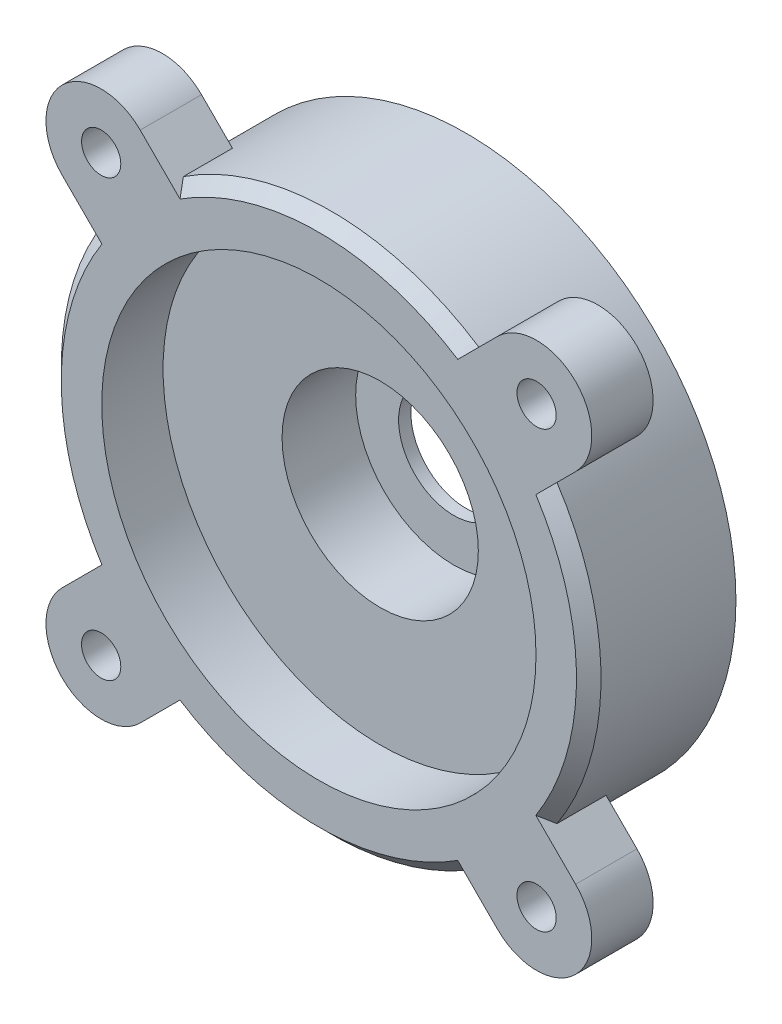
ISO-10303-21;
HEADER;
FILE_DESCRIPTION(('STEP AP214'),'2;1');
FILE_NAME('part.step','',(''),(''),'','','');
FILE_SCHEMA(('AUTOMOTIVE_DESIGN { 1 0 10303 214 1 1 1 1 }'));
ENDSEC;
DATA;
#1=APPLICATION_CONTEXT('core data for automotive mechanical design processes');
#2=APPLICATION_PROTOCOL_DEFINITION('international standard','automotive_design',2000,#1);
#3=PRODUCT_CONTEXT('',#1,'mechanical');
#4=PRODUCT('Part','Part','',(#3));
#5=PRODUCT_RELATED_PRODUCT_CATEGORY('part','',(#4));
#6=PRODUCT_DEFINITION_FORMATION('','',#4);
#7=PRODUCT_DEFINITION_CONTEXT('part definition',#1,'design');
#8=PRODUCT_DEFINITION('design','',#6,#7);
#9=PRODUCT_DEFINITION_SHAPE('','',#8);
#10=(LENGTH_UNIT() NAMED_UNIT(*) SI_UNIT(.MILLI.,.METRE.));
#11=(NAMED_UNIT(*) PLANE_ANGLE_UNIT() SI_UNIT($,.RADIAN.));
#12=(NAMED_UNIT(*) SI_UNIT($,.STERADIAN.) SOLID_ANGLE_UNIT());
#13=UNCERTAINTY_MEASURE_WITH_UNIT(LENGTH_MEASURE(1.E-05),#10,'distance_accuracy_value','');
#14=(GEOMETRIC_REPRESENTATION_CONTEXT(3) GLOBAL_UNCERTAINTY_ASSIGNED_CONTEXT((#13)) GLOBAL_UNIT_ASSIGNED_CONTEXT((#10,
#11,#12)) REPRESENTATION_CONTEXT('',''));
#15=CARTESIAN_POINT('',(0.,0.,0.));
#16=DIRECTION('',(0.,0.,1.));
#17=DIRECTION('',(1.,0.,0.));
#18=AXIS2_PLACEMENT_3D('',#15,#16,#17);
#19=CARTESIAN_POINT('',(0.,0.,6.));
#20=DIRECTION('',(0.,0.,-1.));
#21=DIRECTION('',(-1.,0.,0.));
#22=AXIS2_PLACEMENT_3D('',#19,#20,#21);
#23=CONICAL_SURFACE('',#22,21.,0.785398163397448);
#24=CARTESIAN_POINT('',(-11.3221844044348,17.6861454351131,6.0002));
#25=CARTESIAN_POINT('',(-11.442817573575,17.8067786042533,5.83355757009398));
#26=CARTESIAN_POINT('',(-11.5634193156647,17.9273803463431,5.66686968833641));
#27=CARTESIAN_POINT('',(-11.8045599453449,18.1685209760232,5.33340302166944));
#28=CARTESIAN_POINT('',(-11.9250988329356,18.2890598636139,5.16662423676034));
#29=CARTESIAN_POINT('',(-12.045606293476,18.4095673241543,4.9998));
#30=B_SPLINE_CURVE_WITH_KNOTS('',3,(#24,#25,#26,#27,#28,#29),.UNSPECIFIED.,.F.,.F.,(4,2,4),(0.,
0.715450692106055,1.43090138184667),.UNSPECIFIED.);
#31=CARTESIAN_POINT('',(-11.3223291890206,17.686290219699,6.));
#32=VERTEX_POINT('',#31);
#33=CARTESIAN_POINT('',(-12.045461817502,18.4094228481803,5.00000000000001));
#34=VERTEX_POINT('',#33);
#35=EDGE_CURVE('E771',#32,#34,#30,.T.);
#36=ORIENTED_EDGE('',*,*,#35,.F.);
#37=CARTESIAN_POINT('',(0.,0.,6.));
#38=DIRECTION('',(0.,0.,1.));
#39=DIRECTION('',(1.,0.,0.));
#40=AXIS2_PLACEMENT_3D('',#37,#38,#39);
#41=CIRCLE('',#40,21.);
#42=CARTESIAN_POINT('',(11.3223291890208,17.6862902196998,6.));
#43=VERTEX_POINT('',#42);
#44=EDGE_CURVE('E361',#43,#32,#41,.T.);
#45=ORIENTED_EDGE('',*,*,#44,.F.);
#46=CARTESIAN_POINT('',(12.0456062934756,18.4095673241546,4.99980000000001));
#47=CARTESIAN_POINT('',(11.9250988329352,18.2890598636141,5.16662423676035));
#48=CARTESIAN_POINT('',(11.8045599453445,18.1685209760235,5.33340302166944));
#49=CARTESIAN_POINT('',(11.5634193156643,17.9273803463433,5.66686968833641));
#50=CARTESIAN_POINT('',(11.4428175735746,17.8067786042535,5.83355757009398));
#51=CARTESIAN_POINT('',(11.3221844044344,17.6861454351134,6.0002));
#52=B_SPLINE_CURVE_WITH_KNOTS('',3,(#46,#47,#48,#49,#50,#51),.UNSPECIFIED.,.F.,.F.,(4,2,4),(0.,
0.715450689740613,1.43090138184667),.UNSPECIFIED.);
#53=CARTESIAN_POINT('',(12.0454618175016,18.4094228481805,5.00000000000001));
#54=VERTEX_POINT('',#53);
#55=EDGE_CURVE('E371',#54,#43,#52,.T.);
#56=ORIENTED_EDGE('',*,*,#55,.F.);
#57=CARTESIAN_POINT('',(0.,0.,5.00000000000001));
#58=DIRECTION('',(0.,0.,1.));
#59=DIRECTION('',(1.,0.,0.));
#60=AXIS2_PLACEMENT_3D('',#57,#58,#59);
#61=CIRCLE('',#60,22.);
#62=EDGE_CURVE('E365',#34,#54,#61,.F.);
#63=ORIENTED_EDGE('',*,*,#62,.F.);
#64=EDGE_LOOP('',(#36,#45,#56,#63));
#65=FACE_BOUND('',#64,.T.);
#66=ADVANCED_FACE('F39',(#65),#23,.T.);
#67=CARTESIAN_POINT('',(-18.4095673241548,12.0456062934752,4.99980000000001));
#68=CARTESIAN_POINT('',(-18.2890598636144,11.9250988329348,5.16662423676035));
#69=CARTESIAN_POINT('',(-18.1685209760237,11.8045599453442,5.33340302166944));
#70=CARTESIAN_POINT('',(-17.9273803463436,11.563419315664,5.66686968833641));
#71=CARTESIAN_POINT('',(-17.8067786042538,11.4428175735742,5.83355757009398));
#72=CARTESIAN_POINT('',(-17.6861454351136,11.322184404434,6.0002));
#73=B_SPLINE_CURVE_WITH_KNOTS('',3,(#67,#68,#69,#70,#71,#72),.UNSPECIFIED.,.F.,.F.,(4,2,4),(0.,
0.715450689740612,1.43090138184667),.UNSPECIFIED.);
#74=CARTESIAN_POINT('',(-18.4094228481808,12.0454618175012,5.00000000000001));
#75=VERTEX_POINT('',#74);
#76=CARTESIAN_POINT('',(-17.6862902196996,11.32232918902,6.));
#77=VERTEX_POINT('',#76);
#78=EDGE_CURVE('E222',#75,#77,#73,.T.);
#79=ORIENTED_EDGE('',*,*,#78,.F.);
#80=CARTESIAN_POINT('',(-18.4094228481799,-12.0454618175025,5.00000000000001));
#81=VERTEX_POINT('',#80);
#82=EDGE_CURVE('E822',#81,#75,#61,.F.);
#83=ORIENTED_EDGE('',*,*,#82,.F.);
#84=CARTESIAN_POINT('',(-17.6861454351128,-11.3221844044354,6.0002));
#85=CARTESIAN_POINT('',(-17.8067786042529,-11.4428175735755,5.83355757009397));
#86=CARTESIAN_POINT('',(-17.9273803463427,-11.5634193156653,5.66686968833641));
#87=CARTESIAN_POINT('',(-18.1685209760229,-11.8045599453455,5.33340302166944));
#88=CARTESIAN_POINT('',(-18.2890598636135,-11.9250988329361,5.16662423676035));
#89=CARTESIAN_POINT('',(-18.409567324154,-12.0456062934766,4.99980000000001));
#90=B_SPLINE_CURVE_WITH_KNOTS('',3,(#84,#85,#86,#87,#88,#89),.UNSPECIFIED.,.F.,.F.,(4,2,4),(0.,
0.71545069210605,1.43090138184666),.UNSPECIFIED.);
#91=CARTESIAN_POINT('',(-17.6862902196988,-11.3223291890214,6.));
#92=VERTEX_POINT('',#91);
#93=EDGE_CURVE('E258',#92,#81,#90,.T.);
#94=ORIENTED_EDGE('',*,*,#93,.F.);
#95=EDGE_CURVE('E366',#77,#92,#41,.T.);
#96=ORIENTED_EDGE('',*,*,#95,.F.);
#97=EDGE_LOOP('',(#79,#83,#94,#96));
#98=FACE_BOUND('',#97,.T.);
#99=ADVANCED_FACE('F415',(#98),#23,.T.);
#100=CARTESIAN_POINT('',(-12.0456062934747,-18.4095673241552,4.99980000000001));
#101=CARTESIAN_POINT('',(-11.9250988329342,-18.2890598636147,5.16662423676035));
#102=CARTESIAN_POINT('',(-11.8045599453436,-18.1685209760241,5.33340302166944));
#103=CARTESIAN_POINT('',(-11.5634193156634,-17.9273803463439,5.66686968833641));
#104=CARTESIAN_POINT('',(-11.4428175735736,-17.8067786042541,5.83355757009398));
#105=CARTESIAN_POINT('',(-11.3221844044335,-17.686145435114,6.0002));
#106=B_SPLINE_CURVE_WITH_KNOTS('',3,(#100,#101,#102,#103,#104,#105),.UNSPECIFIED.,.F.,.F.,(4,2,
4),(0.,0.715450689740616,1.43090138184667),.UNSPECIFIED.);
#107=CARTESIAN_POINT('',(-12.0454618175006,-18.4094228481812,5.00000000000001));
#108=VERTEX_POINT('',#107);
#109=CARTESIAN_POINT('',(-11.3223291890198,-17.6862902197004,6.));
#110=VERTEX_POINT('',#109);
#111=EDGE_CURVE('E809',#108,#110,#106,.T.);
#112=ORIENTED_EDGE('',*,*,#111,.F.);
#113=CARTESIAN_POINT('',(12.0454618175022,-18.4094228481801,5.00000000000001));
#114=VERTEX_POINT('',#113);
#115=EDGE_CURVE('E372',#114,#108,#61,.F.);
#116=ORIENTED_EDGE('',*,*,#115,.F.);
#117=CARTESIAN_POINT('',(11.322184404435,-17.686145435113,6.0002));
#118=CARTESIAN_POINT('',(11.4428175735752,-17.8067786042532,5.83355757009398));
#119=CARTESIAN_POINT('',(11.5634193156649,-17.9273803463429,5.66686968833641));
#120=CARTESIAN_POINT('',(11.8045599453451,-18.1685209760231,5.33340302166944));
#121=CARTESIAN_POINT('',(11.9250988329358,-18.2890598636137,5.16662423676035));
#122=CARTESIAN_POINT('',(12.0456062934762,-18.4095673241542,4.99980000000001));
#123=B_SPLINE_CURVE_WITH_KNOTS('',3,(#117,#118,#119,#120,#121,#122),.UNSPECIFIED.,.F.,.F.,(4,2,
4),(0.,0.715450692106052,1.43090138184666),.UNSPECIFIED.);
#124=CARTESIAN_POINT('',(11.3223291890216,-17.6862902196996,6.));
#125=VERTEX_POINT('',#124);
#126=EDGE_CURVE('E440',#125,#114,#123,.T.);
#127=ORIENTED_EDGE('',*,*,#126,.F.);
#128=EDGE_CURVE('E836',#110,#125,#41,.T.);
#129=ORIENTED_EDGE('',*,*,#128,.F.);
#130=EDGE_LOOP('',(#112,#116,#127,#129));
#131=FACE_BOUND('',#130,.T.);
#132=ADVANCED_FACE('F410',(#131),#23,.T.);
#133=CARTESIAN_POINT('',(0.,0.,6.));
#134=DIRECTION('',(0.,0.,-1.));
#135=DIRECTION('',(-1.,0.,0.));
#136=AXIS2_PLACEMENT_3D('',#133,#134,#135);
#137=CYLINDRICAL_SURFACE('',#136,22.);
#138=CARTESIAN_POINT('',(0.,0.,1.));
#139=DIRECTION('',(0.,0.,-1.));
#140=DIRECTION('',(-1.,0.,0.));
#141=AXIS2_PLACEMENT_3D('',#138,#139,#140);
#142=CIRCLE('',#141,22.);
#143=CARTESIAN_POINT('',(-18.4094228481808,12.0454618175012,1.));
#144=VERTEX_POINT('',#143);
#145=CARTESIAN_POINT('',(-12.045461817502,18.4094228481803,1.));
#146=VERTEX_POINT('',#145);
#147=EDGE_CURVE('E11',#144,#146,#142,.T.);
#148=ORIENTED_EDGE('',*,*,#147,.T.);
#149=DIRECTION('',(0.,0.,-1.));
#150=VECTOR('',#149,1.);
#151=CARTESIAN_POINT('',(-12.045461817502,18.4094228481803,6.));
#152=LINE('',#151,#150);
#153=EDGE_CURVE('E230',#146,#34,#152,.F.);
#154=ORIENTED_EDGE('',*,*,#153,.T.);
#155=ORIENTED_EDGE('',*,*,#62,.T.);
#156=DIRECTION('',(0.,0.,-1.));
#157=VECTOR('',#156,1.);
#158=CARTESIAN_POINT('',(12.0454618175016,18.4094228481805,6.));
#159=LINE('',#158,#157);
#160=CARTESIAN_POINT('',(12.0454618175016,18.4094228481805,1.));
#161=VERTEX_POINT('',#160);
#162=EDGE_CURVE('E346',#54,#161,#159,.T.);
#163=ORIENTED_EDGE('',*,*,#162,.T.);
#164=CARTESIAN_POINT('',(0.,0.,1.));
#165=DIRECTION('',(0.,0.,-1.));
#166=DIRECTION('',(-1.,0.,0.));
#167=AXIS2_PLACEMENT_3D('',#164,#165,#166);
#168=CIRCLE('',#167,22.);
#169=CARTESIAN_POINT('',(18.4094228481805,12.0454618175016,1.));
#170=VERTEX_POINT('',#169);
#171=EDGE_CURVE('E441',#161,#170,#168,.T.);
#172=ORIENTED_EDGE('',*,*,#171,.T.);
#173=DIRECTION('',(0.,0.,-1.));
#174=VECTOR('',#173,1.);
#175=CARTESIAN_POINT('',(18.4094228481805,12.0454618175016,6.));
#176=LINE('',#175,#174);
#177=CARTESIAN_POINT('',(18.4094228481805,12.0454618175016,5.00000000000001));
#178=VERTEX_POINT('',#177);
#179=EDGE_CURVE('E352',#170,#178,#176,.F.);
#180=ORIENTED_EDGE('',*,*,#179,.T.);
#181=CARTESIAN_POINT('',(18.4094228481809,-12.045461817501,5.00000000000001));
#182=VERTEX_POINT('',#181);
#183=EDGE_CURVE('E367',#178,#182,#61,.F.);
#184=ORIENTED_EDGE('',*,*,#183,.T.);
#185=DIRECTION('',(0.,0.,-1.));
#186=VECTOR('',#185,1.);
#187=CARTESIAN_POINT('',(18.4094228481809,-12.045461817501,6.));
#188=LINE('',#187,#186);
#189=CARTESIAN_POINT('',(18.4094228481809,-12.045461817501,1.));
#190=VERTEX_POINT('',#189);
#191=EDGE_CURVE('E302',#182,#190,#188,.T.);
#192=ORIENTED_EDGE('',*,*,#191,.T.);
#193=CARTESIAN_POINT('',(0.,0.,1.));
#194=DIRECTION('',(0.,0.,-1.));
#195=DIRECTION('',(-1.,0.,0.));
#196=AXIS2_PLACEMENT_3D('',#193,#194,#195);
#197=CIRCLE('',#196,22.);
#198=CARTESIAN_POINT('',(12.0454618175022,-18.4094228481802,1.));
#199=VERTEX_POINT('',#198);
#200=EDGE_CURVE('E846',#190,#199,#197,.T.);
#201=ORIENTED_EDGE('',*,*,#200,.T.);
#202=DIRECTION('',(0.,0.,-1.));
#203=VECTOR('',#202,1.);
#204=CARTESIAN_POINT('',(12.0454618175022,-18.4094228481801,6.));
#205=LINE('',#204,#203);
#206=EDGE_CURVE('E308',#199,#114,#205,.F.);
#207=ORIENTED_EDGE('',*,*,#206,.T.);
#208=ORIENTED_EDGE('',*,*,#115,.T.);
#209=DIRECTION('',(0.,0.,-1.));
#210=VECTOR('',#209,1.);
#211=CARTESIAN_POINT('',(-12.0454618175006,-18.4094228481812,6.));
#212=LINE('',#211,#210);
#213=CARTESIAN_POINT('',(-12.0454618175006,-18.4094228481812,1.));
#214=VERTEX_POINT('',#213);
#215=EDGE_CURVE('E804',#108,#214,#212,.T.);
#216=ORIENTED_EDGE('',*,*,#215,.T.);
#217=CARTESIAN_POINT('',(0.,0.,1.));
#218=DIRECTION('',(0.,0.,-1.));
#219=DIRECTION('',(-1.,0.,0.));
#220=AXIS2_PLACEMENT_3D('',#217,#218,#219);
#221=CIRCLE('',#220,22.);
#222=CARTESIAN_POINT('',(-18.4094228481799,-12.0454618175025,1.));
#223=VERTEX_POINT('',#222);
#224=EDGE_CURVE('E49',#214,#223,#221,.T.);
#225=ORIENTED_EDGE('',*,*,#224,.T.);
#226=DIRECTION('',(0.,0.,-1.));
#227=VECTOR('',#226,1.);
#228=CARTESIAN_POINT('',(-18.4094228481799,-12.0454618175025,6.));
#229=LINE('',#228,#227);
#230=EDGE_CURVE('E267',#223,#81,#229,.F.);
#231=ORIENTED_EDGE('',*,*,#230,.T.);
#232=ORIENTED_EDGE('',*,*,#82,.T.);
#233=DIRECTION('',(0.,0.,-1.));
#234=VECTOR('',#233,1.);
#235=CARTESIAN_POINT('',(-18.4094228481808,12.0454618175012,6.));
#236=LINE('',#235,#234);
#237=EDGE_CURVE('E218',#75,#144,#236,.T.);
#238=ORIENTED_EDGE('',*,*,#237,.T.);
#239=EDGE_LOOP('',(#148,#154,#155,#163,#172,#180,#184,#192,#201,#207,#208,#216,#225,#231,#232,#238));
#240=FACE_BOUND('',#239,.T.);
#241=CARTESIAN_POINT('',(0.,0.,-6.));
#242=DIRECTION('',(0.,0.,1.));
#243=DIRECTION('',(1.,0.,0.));
#244=AXIS2_PLACEMENT_3D('',#241,#242,#243);
#245=CIRCLE('',#244,22.);
#246=CARTESIAN_POINT('',(22.,0.,-6.));
#247=VERTEX_POINT('',#246);
#248=EDGE_CURVE('E356',#247,#247,#245,.T.);
#249=ORIENTED_EDGE('',*,*,#248,.T.);
#250=EDGE_LOOP('',(#249));
#251=FACE_BOUND('',#250,.T.);
#252=ADVANCED_FACE('F405',(#240,#251),#137,.T.);
#253=CARTESIAN_POINT('',(0.,0.,6.));
#254=DIRECTION('',(0.,0.,1.));
#255=DIRECTION('',(1.,0.,0.));
#256=AXIS2_PLACEMENT_3D('',#253,#254,#255);
#257=PLANE('',#256);
#258=CARTESIAN_POINT('',(0.,0.,6.));
#259=DIRECTION('',(0.,0.,1.));
#260=DIRECTION('',(1.,0.,0.));
#261=AXIS2_PLACEMENT_3D('',#258,#259,#260);
#262=CIRCLE('',#261,17.7);
#263=CARTESIAN_POINT('',(17.7,0.,6.));
#264=VERTEX_POINT('',#263);
#265=EDGE_CURVE('E739',#264,#264,#262,.T.);
#266=ORIENTED_EDGE('',*,*,#265,.F.);
#267=EDGE_LOOP('',(#266));
#268=FACE_BOUND('',#267,.T.);
#269=ORIENTED_EDGE('',*,*,#44,.T.);
#270=DIRECTION('',(-0.707106781186548,0.707106781186547,0.));
#271=VECTOR('',#270,1.);
#272=CARTESIAN_POINT('',(-14.5663996924429,20.9303607231212,6.));
#273=LINE('',#272,#271);
#274=CARTESIAN_POINT('',(-14.5663996924429,20.9303607231212,6.));
#275=VERTEX_POINT('',#274);
#276=EDGE_CURVE('E200',#32,#275,#273,.T.);
#277=ORIENTED_EDGE('',*,*,#276,.T.);
#278=CARTESIAN_POINT('',(-17.7483802077823,17.7483802077817,6.));
#279=DIRECTION('',(0.,0.,1.));
#280=DIRECTION('',(-1.,0.,0.));
#281=AXIS2_PLACEMENT_3D('',#278,#279,#280);
#282=CIRCLE('',#281,4.50000000000002);
#283=CARTESIAN_POINT('',(-20.9303607231218,14.5663996924422,6.));
#284=VERTEX_POINT('',#283);
#285=EDGE_CURVE('E211',#275,#284,#282,.T.);
#286=ORIENTED_EDGE('',*,*,#285,.T.);
#287=DIRECTION('',(0.707106781186548,-0.707106781186548,0.));
#288=VECTOR('',#287,1.);
#289=CARTESIAN_POINT('',(-20.9303607231218,14.5663996924422,6.));
#290=LINE('',#289,#288);
#291=EDGE_CURVE('E184',#284,#77,#290,.T.);
#292=ORIENTED_EDGE('',*,*,#291,.T.);
#293=ORIENTED_EDGE('',*,*,#95,.T.);
#294=DIRECTION('',(-0.707106781186547,-0.707106781186548,0.));
#295=VECTOR('',#294,1.);
#296=CARTESIAN_POINT('',(-20.930360723121,-14.5663996924436,6.));
#297=LINE('',#296,#295);
#298=CARTESIAN_POINT('',(-20.930360723121,-14.5663996924436,6.));
#299=VERTEX_POINT('',#298);
#300=EDGE_CURVE('E784',#92,#299,#297,.T.);
#301=ORIENTED_EDGE('',*,*,#300,.T.);
#302=CARTESIAN_POINT('',(-17.7483802077815,-17.7483802077831,6.));
#303=DIRECTION('',(0.,0.,1.));
#304=DIRECTION('',(-1.,0.,0.));
#305=AXIS2_PLACEMENT_3D('',#302,#303,#304);
#306=CIRCLE('',#305,4.50000000000002);
#307=CARTESIAN_POINT('',(-14.566399692442,-20.9303607231226,6.));
#308=VERTEX_POINT('',#307);
#309=EDGE_CURVE('E776',#299,#308,#306,.T.);
#310=ORIENTED_EDGE('',*,*,#309,.T.);
#311=DIRECTION('',(0.707106781186547,0.707106781186548,0.));
#312=VECTOR('',#311,1.);
#313=CARTESIAN_POINT('',(-14.566399692442,-20.9303607231226,6.));
#314=LINE('',#313,#312);
#315=EDGE_CURVE('E794',#308,#110,#314,.T.);
#316=ORIENTED_EDGE('',*,*,#315,.T.);
#317=ORIENTED_EDGE('',*,*,#128,.T.);
#318=DIRECTION('',(0.707106781186548,-0.707106781186547,0.));
#319=VECTOR('',#318,1.);
#320=CARTESIAN_POINT('',(14.5663996924438,-20.9303607231218,6.));
#321=LINE('',#320,#319);
#322=CARTESIAN_POINT('',(14.5663996924438,-20.9303607231218,6.));
#323=VERTEX_POINT('',#322);
#324=EDGE_CURVE('E282',#125,#323,#321,.T.);
#325=ORIENTED_EDGE('',*,*,#324,.T.);
#326=CARTESIAN_POINT('',(17.7483802077833,-17.7483802077823,6.));
#327=DIRECTION('',(0.,0.,1.));
#328=DIRECTION('',(-1.,0.,0.));
#329=AXIS2_PLACEMENT_3D('',#326,#327,#328);
#330=CIRCLE('',#329,4.50000000000002);
#331=CARTESIAN_POINT('',(20.9303607231227,-14.5663996924428,6.));
#332=VERTEX_POINT('',#331);
#333=EDGE_CURVE('E273',#323,#332,#330,.T.);
#334=ORIENTED_EDGE('',*,*,#333,.T.);
#335=DIRECTION('',(-0.707106781186548,0.707106781186547,0.));
#336=VECTOR('',#335,1.);
#337=CARTESIAN_POINT('',(20.9303607231227,-14.5663996924428,6.));
#338=LINE('',#337,#336);
#339=CARTESIAN_POINT('',(17.6862902196987,-11.3223291890225,6.));
#340=VERTEX_POINT('',#339);
#341=EDGE_CURVE('E293',#332,#340,#338,.T.);
#342=ORIENTED_EDGE('',*,*,#341,.T.);
#343=CARTESIAN_POINT('',(17.6862902196998,11.3223291890208,6.));
#344=VERTEX_POINT('',#343);
#345=EDGE_CURVE('E360',#340,#344,#41,.T.);
#346=ORIENTED_EDGE('',*,*,#345,.T.);
#347=DIRECTION('',(0.707106781186547,0.707106781186548,0.));
#348=VECTOR('',#347,1.);
#349=CARTESIAN_POINT('',(20.930360723122,14.566399692443,6.));
#350=LINE('',#349,#348);
#351=CARTESIAN_POINT('',(20.930360723122,14.566399692443,6.));
#352=VERTEX_POINT('',#351);
#353=EDGE_CURVE('E326',#344,#352,#350,.T.);
#354=ORIENTED_EDGE('',*,*,#353,.T.);
#355=CARTESIAN_POINT('',(17.7483802077825,17.7483802077825,6.));
#356=DIRECTION('',(0.,0.,1.));
#357=DIRECTION('',(-1.,0.,0.));
#358=AXIS2_PLACEMENT_3D('',#355,#356,#357);
#359=CIRCLE('',#358,4.50000000000002);
#360=CARTESIAN_POINT('',(14.566399692443,20.930360723122,6.));
#361=VERTEX_POINT('',#360);
#362=EDGE_CURVE('E317',#352,#361,#359,.T.);
#363=ORIENTED_EDGE('',*,*,#362,.T.);
#364=DIRECTION('',(-0.707106781186547,-0.707106781186548,0.));
#365=VECTOR('',#364,1.);
#366=CARTESIAN_POINT('',(14.566399692443,20.930360723122,6.));
#367=LINE('',#366,#365);
#368=EDGE_CURVE('E337',#361,#43,#367,.T.);
#369=ORIENTED_EDGE('',*,*,#368,.T.);
#370=EDGE_LOOP('',(#269,#277,#286,#292,#293,#301,#310,#316,#317,#325,#334,#342,#346,#354,#363,#369));
#371=FACE_BOUND('',#370,.T.);
#372=CARTESIAN_POINT('',(17.7483802077825,17.7483802077825,6.));
#373=DIRECTION('',(0.,0.,1.));
#374=DIRECTION('',(1.,0.,0.));
#375=AXIS2_PLACEMENT_3D('',#372,#373,#374);
#376=CIRCLE('',#375,1.59999999999981);
#377=CARTESIAN_POINT('',(19.3483802077823,17.7483802077825,6.));
#378=VERTEX_POINT('',#377);
#379=EDGE_CURVE('E312',#378,#378,#376,.T.);
#380=ORIENTED_EDGE('',*,*,#379,.F.);
#381=EDGE_LOOP('',(#380));
#382=FACE_BOUND('',#381,.T.);
#383=CARTESIAN_POINT('',(17.7483802077833,-17.7483802077823,6.));
#384=DIRECTION('',(0.,0.,1.));
#385=DIRECTION('',(1.,0.,0.));
#386=AXIS2_PLACEMENT_3D('',#383,#384,#385);
#387=CIRCLE('',#386,1.59999999999979);
#388=CARTESIAN_POINT('',(19.3483802077831,-17.7483802077823,6.));
#389=VERTEX_POINT('',#388);
#390=EDGE_CURVE('E266',#389,#389,#387,.T.);
#391=ORIENTED_EDGE('',*,*,#390,.F.);
#392=EDGE_LOOP('',(#391));
#393=FACE_BOUND('',#392,.T.);
#394=CARTESIAN_POINT('',(-17.7483802077815,-17.7483802077831,6.));
#395=DIRECTION('',(0.,0.,1.));
#396=DIRECTION('',(1.,0.,0.));
#397=AXIS2_PLACEMENT_3D('',#394,#395,#396);
#398=CIRCLE('',#397,1.60000000000064);
#399=CARTESIAN_POINT('',(-16.1483802077809,-17.7483802077831,6.));
#400=VERTEX_POINT('',#399);
#401=EDGE_CURVE('E767',#400,#400,#398,.T.);
#402=ORIENTED_EDGE('',*,*,#401,.F.);
#403=EDGE_LOOP('',(#402));
#404=FACE_BOUND('',#403,.T.);
#405=CARTESIAN_POINT('',(-17.7483802077823,17.7483802077817,6.));
#406=DIRECTION('',(0.,0.,1.));
#407=DIRECTION('',(1.,0.,0.));
#408=AXIS2_PLACEMENT_3D('',#405,#406,#407);
#409=CIRCLE('',#408,1.60000000000074);
#410=CARTESIAN_POINT('',(-16.1483802077816,17.7483802077817,6.));
#411=VERTEX_POINT('',#410);
#412=EDGE_CURVE('E206',#411,#411,#409,.T.);
#413=ORIENTED_EDGE('',*,*,#412,.F.);
#414=EDGE_LOOP('',(#413));
#415=FACE_BOUND('',#414,.T.);
#416=ADVANCED_FACE('F401',(#268,#371,#382,#393,#404,#415),#257,.T.);
#417=CARTESIAN_POINT('',(0.,0.,-6.));
#418=DIRECTION('',(0.,0.,1.));
#419=DIRECTION('',(1.,0.,0.));
#420=AXIS2_PLACEMENT_3D('',#417,#418,#419);
#421=PLANE('',#420);
#422=CARTESIAN_POINT('',(0.,0.,-6.));
#423=DIRECTION('',(0.,0.,1.));
#424=DIRECTION('',(1.,0.,0.));
#425=AXIS2_PLACEMENT_3D('',#422,#423,#424);
#426=CIRCLE('',#425,4.5);
#427=CARTESIAN_POINT('',(4.5,0.,-6.));
#428=VERTEX_POINT('',#427);
#429=EDGE_CURVE('E725',#428,#428,#426,.T.);
#430=ORIENTED_EDGE('',*,*,#429,.T.);
#431=EDGE_LOOP('',(#430));
#432=FACE_BOUND('',#431,.T.);
#433=ORIENTED_EDGE('',*,*,#248,.F.);
#434=EDGE_LOOP('',(#433));
#435=FACE_BOUND('',#434,.T.);
#436=ADVANCED_FACE('F404',(#432,#435),#421,.F.);
#437=CARTESIAN_POINT('',(18.409567324155,-12.045606293475,4.99980000000001));
#438=CARTESIAN_POINT('',(18.2890598636145,-11.9250988329346,5.16662423676035));
#439=CARTESIAN_POINT('',(18.1685209760239,-11.804559945344,5.33340302166944));
#440=CARTESIAN_POINT('',(17.9273803463437,-11.5634193156638,5.66686968833641));
#441=CARTESIAN_POINT('',(17.8067786042539,-11.442817573574,5.83355757009398));
#442=CARTESIAN_POINT('',(17.6861454351138,-11.3221844044338,6.0002));
#443=B_SPLINE_CURVE_WITH_KNOTS('',3,(#437,#438,#439,#440,#441,#442),.UNSPECIFIED.,.F.,.F.,(4,2,
4),(0.,0.715450689740612,1.43090138184667),.UNSPECIFIED.);
#444=EDGE_CURVE('E435',#182,#340,#443,.T.);
#445=ORIENTED_EDGE('',*,*,#444,.F.);
#446=ORIENTED_EDGE('',*,*,#183,.F.);
#447=CARTESIAN_POINT('',(17.6861454351134,11.3221844044344,6.0002));
#448=CARTESIAN_POINT('',(17.8067786042535,11.4428175735746,5.83355757009397));
#449=CARTESIAN_POINT('',(17.9273803463433,11.5634193156644,5.6668696883364));
#450=CARTESIAN_POINT('',(18.1685209760235,11.8045599453445,5.33340302166944));
#451=CARTESIAN_POINT('',(18.2890598636141,11.9250988329352,5.16662423676034));
#452=CARTESIAN_POINT('',(18.4095673241546,12.0456062934756,4.9998));
#453=B_SPLINE_CURVE_WITH_KNOTS('',3,(#447,#448,#449,#450,#451,#452),.UNSPECIFIED.,.F.,.F.,(4,2,
4),(0.,0.715450692106056,1.43090138184667),.UNSPECIFIED.);
#454=EDGE_CURVE('E381',#344,#178,#453,.T.);
#455=ORIENTED_EDGE('',*,*,#454,.F.);
#456=ORIENTED_EDGE('',*,*,#345,.F.);
#457=EDGE_LOOP('',(#445,#446,#455,#456));
#458=FACE_BOUND('',#457,.T.);
#459=ADVANCED_FACE('F41',(#458),#23,.T.);
#460=CARTESIAN_POINT('',(20.930360723122,14.566399692443,1.));
#461=DIRECTION('',(0.707106781186548,-0.707106781186547,0.));
#462=DIRECTION('',(0.707106781186547,0.707106781186548,0.));
#463=AXIS2_PLACEMENT_3D('',#460,#461,#462);
#464=PLANE('',#463);
#465=ORIENTED_EDGE('',*,*,#179,.F.);
#466=DIRECTION('',(0.707106781186547,0.707106781186548,0.));
#467=VECTOR('',#466,1.);
#468=CARTESIAN_POINT('',(20.930360723122,14.566399692443,1.));
#469=LINE('',#468,#467);
#470=CARTESIAN_POINT('',(20.930360723122,14.566399692443,1.));
#471=VERTEX_POINT('',#470);
#472=EDGE_CURVE('E330',#170,#471,#469,.T.);
#473=ORIENTED_EDGE('',*,*,#472,.T.);
#474=DIRECTION('',(0.,0.,1.));
#475=VECTOR('',#474,1.);
#476=CARTESIAN_POINT('',(20.930360723122,14.566399692443,1.));
#477=LINE('',#476,#475);
#478=EDGE_CURVE('E343',#471,#352,#477,.T.);
#479=ORIENTED_EDGE('',*,*,#478,.T.);
#480=ORIENTED_EDGE('',*,*,#353,.F.);
#481=ORIENTED_EDGE('',*,*,#454,.T.);
#482=EDGE_LOOP('',(#465,#473,#479,#480,#481));
#483=FACE_BOUND('',#482,.T.);
#484=ADVANCED_FACE('F393',(#483),#464,.T.);
#485=CARTESIAN_POINT('',(14.566399692443,20.930360723122,1.));
#486=DIRECTION('',(-0.707106781186548,0.707106781186547,0.));
#487=DIRECTION('',(-0.707106781186547,-0.707106781186548,0.));
#488=AXIS2_PLACEMENT_3D('',#485,#486,#487);
#489=PLANE('',#488);
#490=ORIENTED_EDGE('',*,*,#162,.F.);
#491=ORIENTED_EDGE('',*,*,#55,.T.);
#492=ORIENTED_EDGE('',*,*,#368,.F.);
#493=DIRECTION('',(0.,0.,1.));
#494=VECTOR('',#493,1.);
#495=CARTESIAN_POINT('',(14.566399692443,20.930360723122,1.));
#496=LINE('',#495,#494);
#497=CARTESIAN_POINT('',(14.566399692443,20.930360723122,1.));
#498=VERTEX_POINT('',#497);
#499=EDGE_CURVE('E333',#498,#361,#496,.T.);
#500=ORIENTED_EDGE('',*,*,#499,.F.);
#501=DIRECTION('',(-0.707106781186547,-0.707106781186548,0.));
#502=VECTOR('',#501,1.);
#503=CARTESIAN_POINT('',(14.566399692443,20.930360723122,1.));
#504=LINE('',#503,#502);
#505=EDGE_CURVE('E325',#498,#161,#504,.T.);
#506=ORIENTED_EDGE('',*,*,#505,.T.);
#507=EDGE_LOOP('',(#490,#491,#492,#500,#506));
#508=FACE_BOUND('',#507,.T.);
#509=ADVANCED_FACE('F388',(#508),#489,.T.);
#510=CARTESIAN_POINT('',(17.7483802077825,17.7483802077825,1.));
#511=DIRECTION('',(0.,0.,1.));
#512=DIRECTION('',(1.,0.,0.));
#513=AXIS2_PLACEMENT_3D('',#510,#511,#512);
#514=CYLINDRICAL_SURFACE('',#513,4.50000000000002);
#515=ORIENTED_EDGE('',*,*,#362,.F.);
#516=ORIENTED_EDGE('',*,*,#478,.F.);
#517=CARTESIAN_POINT('',(17.7483802077825,17.7483802077825,1.));
#518=DIRECTION('',(0.,0.,1.));
#519=DIRECTION('',(-1.,0.,0.));
#520=AXIS2_PLACEMENT_3D('',#517,#518,#519);
#521=CIRCLE('',#520,4.50000000000002);
#522=EDGE_CURVE('E321',#471,#498,#521,.T.);
#523=ORIENTED_EDGE('',*,*,#522,.T.);
#524=ORIENTED_EDGE('',*,*,#499,.T.);
#525=EDGE_LOOP('',(#515,#516,#523,#524));
#526=FACE_BOUND('',#525,.T.);
#527=ADVANCED_FACE('F392',(#526),#514,.T.);
#528=CARTESIAN_POINT('',(17.7483802077825,17.7483802077825,1.));
#529=DIRECTION('',(0.,0.,-1.));
#530=DIRECTION('',(-1.,0.,0.));
#531=AXIS2_PLACEMENT_3D('',#528,#529,#530);
#532=PLANE('',#531);
#533=ORIENTED_EDGE('',*,*,#171,.F.);
#534=ORIENTED_EDGE('',*,*,#505,.F.);
#535=ORIENTED_EDGE('',*,*,#522,.F.);
#536=ORIENTED_EDGE('',*,*,#472,.F.);
#537=EDGE_LOOP('',(#533,#534,#535,#536));
#538=FACE_BOUND('',#537,.T.);
#539=CARTESIAN_POINT('',(17.7483802077825,17.7483802077825,1.));
#540=DIRECTION('',(0.,0.,1.));
#541=DIRECTION('',(1.,0.,0.));
#542=AXIS2_PLACEMENT_3D('',#539,#540,#541);
#543=CIRCLE('',#542,1.59999999999981);
#544=CARTESIAN_POINT('',(19.3483802077823,17.7483802077825,1.));
#545=VERTEX_POINT('',#544);
#546=EDGE_CURVE('E313',#545,#545,#543,.T.);
#547=ORIENTED_EDGE('',*,*,#546,.T.);
#548=EDGE_LOOP('',(#547));
#549=FACE_BOUND('',#548,.T.);
#550=ADVANCED_FACE('F399',(#538,#549),#532,.T.);
#551=CARTESIAN_POINT('',(17.7483802077825,17.7483802077825,1.));
#552=DIRECTION('',(0.,0.,1.));
#553=DIRECTION('',(1.,0.,0.));
#554=AXIS2_PLACEMENT_3D('',#551,#552,#553);
#555=CYLINDRICAL_SURFACE('',#554,1.59999999999981);
#556=ORIENTED_EDGE('',*,*,#546,.F.);
#557=EDGE_LOOP('',(#556));
#558=FACE_BOUND('',#557,.T.);
#559=ORIENTED_EDGE('',*,*,#379,.T.);
#560=EDGE_LOOP('',(#559));
#561=FACE_BOUND('',#560,.T.);
#562=ADVANCED_FACE('F481',(#558,#561),#555,.F.);
#563=CARTESIAN_POINT('',(14.5663996924438,-20.9303607231218,1.));
#564=DIRECTION('',(-0.707106781186547,-0.707106781186548,0.));
#565=DIRECTION('',(0.707106781186548,-0.707106781186547,0.));
#566=AXIS2_PLACEMENT_3D('',#563,#564,#565);
#567=PLANE('',#566);
#568=ORIENTED_EDGE('',*,*,#206,.F.);
#569=DIRECTION('',(0.707106781186548,-0.707106781186547,0.));
#570=VECTOR('',#569,1.);
#571=CARTESIAN_POINT('',(14.5663996924438,-20.9303607231218,1.));
#572=LINE('',#571,#570);
#573=CARTESIAN_POINT('',(14.5663996924438,-20.9303607231218,1.));
#574=VERTEX_POINT('',#573);
#575=EDGE_CURVE('E286',#199,#574,#572,.T.);
#576=ORIENTED_EDGE('',*,*,#575,.T.);
#577=DIRECTION('',(0.,0.,1.));
#578=VECTOR('',#577,1.);
#579=CARTESIAN_POINT('',(14.5663996924438,-20.9303607231218,1.));
#580=LINE('',#579,#578);
#581=EDGE_CURVE('E299',#574,#323,#580,.T.);
#582=ORIENTED_EDGE('',*,*,#581,.T.);
#583=ORIENTED_EDGE('',*,*,#324,.F.);
#584=ORIENTED_EDGE('',*,*,#126,.T.);
#585=EDGE_LOOP('',(#568,#576,#582,#583,#584));
#586=FACE_BOUND('',#585,.T.);
#587=ADVANCED_FACE('F474',(#586),#567,.T.);
#588=CARTESIAN_POINT('',(20.9303607231227,-14.5663996924428,1.));
#589=DIRECTION('',(0.707106781186547,0.707106781186548,0.));
#590=DIRECTION('',(-0.707106781186548,0.707106781186547,0.));
#591=AXIS2_PLACEMENT_3D('',#588,#589,#590);
#592=PLANE('',#591);
#593=ORIENTED_EDGE('',*,*,#191,.F.);
#594=ORIENTED_EDGE('',*,*,#444,.T.);
#595=ORIENTED_EDGE('',*,*,#341,.F.);
#596=DIRECTION('',(0.,0.,1.));
#597=VECTOR('',#596,1.);
#598=CARTESIAN_POINT('',(20.9303607231227,-14.5663996924428,1.));
#599=LINE('',#598,#597);
#600=CARTESIAN_POINT('',(20.9303607231227,-14.5663996924428,1.));
#601=VERTEX_POINT('',#600);
#602=EDGE_CURVE('E289',#601,#332,#599,.T.);
#603=ORIENTED_EDGE('',*,*,#602,.F.);
#604=DIRECTION('',(-0.707106781186548,0.707106781186547,0.));
#605=VECTOR('',#604,1.);
#606=CARTESIAN_POINT('',(20.9303607231227,-14.5663996924428,1.));
#607=LINE('',#606,#605);
#608=EDGE_CURVE('E281',#601,#190,#607,.T.);
#609=ORIENTED_EDGE('',*,*,#608,.T.);
#610=EDGE_LOOP('',(#593,#594,#595,#603,#609));
#611=FACE_BOUND('',#610,.T.);
#612=ADVANCED_FACE('F469',(#611),#592,.T.);
#613=CARTESIAN_POINT('',(17.7483802077833,-17.7483802077823,1.));
#614=DIRECTION('',(0.,0.,1.));
#615=DIRECTION('',(1.,0.,0.));
#616=AXIS2_PLACEMENT_3D('',#613,#614,#615);
#617=CYLINDRICAL_SURFACE('',#616,4.50000000000002);
#618=ORIENTED_EDGE('',*,*,#333,.F.);
#619=ORIENTED_EDGE('',*,*,#581,.F.);
#620=CARTESIAN_POINT('',(17.7483802077833,-17.7483802077823,1.));
#621=DIRECTION('',(0.,0.,1.));
#622=DIRECTION('',(-1.,0.,0.));
#623=AXIS2_PLACEMENT_3D('',#620,#621,#622);
#624=CIRCLE('',#623,4.50000000000002);
#625=EDGE_CURVE('E277',#574,#601,#624,.T.);
#626=ORIENTED_EDGE('',*,*,#625,.T.);
#627=ORIENTED_EDGE('',*,*,#602,.T.);
#628=EDGE_LOOP('',(#618,#619,#626,#627));
#629=FACE_BOUND('',#628,.T.);
#630=ADVANCED_FACE('F473',(#629),#617,.T.);
#631=CARTESIAN_POINT('',(17.7483802077833,-17.7483802077823,1.));
#632=DIRECTION('',(0.,0.,-1.));
#633=DIRECTION('',(-1.,0.,0.));
#634=AXIS2_PLACEMENT_3D('',#631,#632,#633);
#635=PLANE('',#634);
#636=ORIENTED_EDGE('',*,*,#200,.F.);
#637=ORIENTED_EDGE('',*,*,#608,.F.);
#638=ORIENTED_EDGE('',*,*,#625,.F.);
#639=ORIENTED_EDGE('',*,*,#575,.F.);
#640=EDGE_LOOP('',(#636,#637,#638,#639));
#641=FACE_BOUND('',#640,.T.);
#642=CARTESIAN_POINT('',(17.7483802077833,-17.7483802077823,1.));
#643=DIRECTION('',(0.,0.,1.));
#644=DIRECTION('',(1.,0.,0.));
#645=AXIS2_PLACEMENT_3D('',#642,#643,#644);
#646=CIRCLE('',#645,1.59999999999979);
#647=CARTESIAN_POINT('',(19.3483802077831,-17.7483802077823,1.));
#648=VERTEX_POINT('',#647);
#649=EDGE_CURVE('E269',#648,#648,#646,.T.);
#650=ORIENTED_EDGE('',*,*,#649,.T.);
#651=EDGE_LOOP('',(#650));
#652=FACE_BOUND('',#651,.T.);
#653=ADVANCED_FACE('F479',(#641,#652),#635,.T.);
#654=CARTESIAN_POINT('',(17.7483802077833,-17.7483802077823,1.));
#655=DIRECTION('',(0.,0.,1.));
#656=DIRECTION('',(1.,0.,0.));
#657=AXIS2_PLACEMENT_3D('',#654,#655,#656);
#658=CYLINDRICAL_SURFACE('',#657,1.59999999999979);
#659=ORIENTED_EDGE('',*,*,#649,.F.);
#660=EDGE_LOOP('',(#659));
#661=FACE_BOUND('',#660,.T.);
#662=ORIENTED_EDGE('',*,*,#390,.T.);
#663=EDGE_LOOP('',(#662));
#664=FACE_BOUND('',#663,.T.);
#665=ADVANCED_FACE('F513',(#661,#664),#658,.F.);
#666=CARTESIAN_POINT('',(-17.7483802077815,-17.7483802077831,1.));
#667=DIRECTION('',(0.,0.,1.));
#668=DIRECTION('',(1.,0.,0.));
#669=AXIS2_PLACEMENT_3D('',#666,#667,#668);
#670=CYLINDRICAL_SURFACE('',#669,4.50000000000002);
#671=ORIENTED_EDGE('',*,*,#309,.F.);
#672=DIRECTION('',(0.,0.,1.));
#673=VECTOR('',#672,1.);
#674=CARTESIAN_POINT('',(-20.930360723121,-14.5663996924436,1.));
#675=LINE('',#674,#673);
#676=CARTESIAN_POINT('',(-20.930360723121,-14.5663996924436,1.));
#677=VERTEX_POINT('',#676);
#678=EDGE_CURVE('E801',#677,#299,#675,.T.);
#679=ORIENTED_EDGE('',*,*,#678,.F.);
#680=CARTESIAN_POINT('',(-17.7483802077815,-17.7483802077831,1.));
#681=DIRECTION('',(0.,0.,1.));
#682=DIRECTION('',(-1.,0.,0.));
#683=AXIS2_PLACEMENT_3D('',#680,#681,#682);
#684=CIRCLE('',#683,4.50000000000002);
#685=CARTESIAN_POINT('',(-14.566399692442,-20.9303607231226,1.));
#686=VERTEX_POINT('',#685);
#687=EDGE_CURVE('E779',#677,#686,#684,.T.);
#688=ORIENTED_EDGE('',*,*,#687,.T.);
#689=DIRECTION('',(0.,0.,1.));
#690=VECTOR('',#689,1.);
#691=CARTESIAN_POINT('',(-14.566399692442,-20.9303607231226,1.));
#692=LINE('',#691,#690);
#693=EDGE_CURVE('E790',#686,#308,#692,.T.);
#694=ORIENTED_EDGE('',*,*,#693,.T.);
#695=EDGE_LOOP('',(#671,#679,#688,#694));
#696=FACE_BOUND('',#695,.T.);
#697=ADVANCED_FACE('F253',(#696),#670,.T.);
#698=CARTESIAN_POINT('',(-20.930360723121,-14.5663996924436,1.));
#699=DIRECTION('',(-0.707106781186548,0.707106781186547,0.));
#700=DIRECTION('',(-0.707106781186547,-0.707106781186548,0.));
#701=AXIS2_PLACEMENT_3D('',#698,#699,#700);
#702=PLANE('',#701);
#703=ORIENTED_EDGE('',*,*,#300,.F.);
#704=ORIENTED_EDGE('',*,*,#93,.T.);
#705=ORIENTED_EDGE('',*,*,#230,.F.);
#706=DIRECTION('',(-0.707106781186547,-0.707106781186548,0.));
#707=VECTOR('',#706,1.);
#708=CARTESIAN_POINT('',(-20.930360723121,-14.5663996924436,1.));
#709=LINE('',#708,#707);
#710=EDGE_CURVE('E64',#223,#677,#709,.T.);
#711=ORIENTED_EDGE('',*,*,#710,.T.);
#712=ORIENTED_EDGE('',*,*,#678,.T.);
#713=EDGE_LOOP('',(#703,#704,#705,#711,#712));
#714=FACE_BOUND('',#713,.T.);
#715=ADVANCED_FACE('F249',(#714),#702,.T.);
#716=CARTESIAN_POINT('',(-14.566399692442,-20.9303607231226,1.));
#717=DIRECTION('',(0.707106781186548,-0.707106781186547,0.));
#718=DIRECTION('',(0.707106781186547,0.707106781186548,0.));
#719=AXIS2_PLACEMENT_3D('',#716,#717,#718);
#720=PLANE('',#719);
#721=ORIENTED_EDGE('',*,*,#215,.F.);
#722=ORIENTED_EDGE('',*,*,#111,.T.);
#723=ORIENTED_EDGE('',*,*,#315,.F.);
#724=ORIENTED_EDGE('',*,*,#693,.F.);
#725=DIRECTION('',(0.707106781186547,0.707106781186548,0.));
#726=VECTOR('',#725,1.);
#727=CARTESIAN_POINT('',(-14.566399692442,-20.9303607231226,1.));
#728=LINE('',#727,#726);
#729=EDGE_CURVE('E783',#686,#214,#728,.T.);
#730=ORIENTED_EDGE('',*,*,#729,.T.);
#731=EDGE_LOOP('',(#721,#722,#723,#724,#730));
#732=FACE_BOUND('',#731,.T.);
#733=ADVANCED_FACE('F248',(#732),#720,.T.);
#734=CARTESIAN_POINT('',(-17.7483802077815,-17.7483802077831,1.));
#735=DIRECTION('',(0.,0.,-1.));
#736=DIRECTION('',(-1.,0.,0.));
#737=AXIS2_PLACEMENT_3D('',#734,#735,#736);
#738=PLANE('',#737);
#739=ORIENTED_EDGE('',*,*,#224,.F.);
#740=ORIENTED_EDGE('',*,*,#729,.F.);
#741=ORIENTED_EDGE('',*,*,#687,.F.);
#742=ORIENTED_EDGE('',*,*,#710,.F.);
#743=EDGE_LOOP('',(#739,#740,#741,#742));
#744=FACE_BOUND('',#743,.T.);
#745=CARTESIAN_POINT('',(-17.7483802077815,-17.7483802077831,1.));
#746=DIRECTION('',(0.,0.,1.));
#747=DIRECTION('',(1.,0.,0.));
#748=AXIS2_PLACEMENT_3D('',#745,#746,#747);
#749=CIRCLE('',#748,1.60000000000064);
#750=CARTESIAN_POINT('',(-16.1483802077809,-17.7483802077831,1.));
#751=VERTEX_POINT('',#750);
#752=EDGE_CURVE('E770',#751,#751,#749,.T.);
#753=ORIENTED_EDGE('',*,*,#752,.T.);
#754=EDGE_LOOP('',(#753));
#755=FACE_BOUND('',#754,.T.);
#756=ADVANCED_FACE('F244',(#744,#755),#738,.T.);
#757=CARTESIAN_POINT('',(-17.7483802077815,-17.7483802077831,1.));
#758=DIRECTION('',(0.,0.,1.));
#759=DIRECTION('',(1.,0.,0.));
#760=AXIS2_PLACEMENT_3D('',#757,#758,#759);
#761=CYLINDRICAL_SURFACE('',#760,1.60000000000064);
#762=ORIENTED_EDGE('',*,*,#752,.F.);
#763=EDGE_LOOP('',(#762));
#764=FACE_BOUND('',#763,.T.);
#765=ORIENTED_EDGE('',*,*,#401,.T.);
#766=EDGE_LOOP('',(#765));
#767=FACE_BOUND('',#766,.T.);
#768=ADVANCED_FACE('F241',(#764,#767),#761,.F.);
#769=CARTESIAN_POINT('',(-17.7483802077823,17.7483802077817,1.));
#770=DIRECTION('',(0.,0.,1.));
#771=DIRECTION('',(1.,0.,0.));
#772=AXIS2_PLACEMENT_3D('',#769,#770,#771);
#773=CYLINDRICAL_SURFACE('',#772,4.50000000000002);
#774=ORIENTED_EDGE('',*,*,#285,.F.);
#775=DIRECTION('',(0.,0.,1.));
#776=VECTOR('',#775,1.);
#777=CARTESIAN_POINT('',(-14.5663996924429,20.9303607231212,1.));
#778=LINE('',#777,#776);
#779=CARTESIAN_POINT('',(-14.5663996924429,20.9303607231212,1.));
#780=VERTEX_POINT('',#779);
#781=EDGE_CURVE('E190',#780,#275,#778,.T.);
#782=ORIENTED_EDGE('',*,*,#781,.F.);
#783=CARTESIAN_POINT('',(-17.7483802077823,17.7483802077817,1.));
#784=DIRECTION('',(0.,0.,1.));
#785=DIRECTION('',(-1.,0.,0.));
#786=AXIS2_PLACEMENT_3D('',#783,#784,#785);
#787=CIRCLE('',#786,4.50000000000002);
#788=CARTESIAN_POINT('',(-20.9303607231218,14.5663996924422,1.));
#789=VERTEX_POINT('',#788);
#790=EDGE_CURVE('E194',#780,#789,#787,.T.);
#791=ORIENTED_EDGE('',*,*,#790,.T.);
#792=DIRECTION('',(0.,0.,1.));
#793=VECTOR('',#792,1.);
#794=CARTESIAN_POINT('',(-20.9303607231218,14.5663996924422,1.));
#795=LINE('',#794,#793);
#796=EDGE_CURVE('E178',#789,#284,#795,.T.);
#797=ORIENTED_EDGE('',*,*,#796,.T.);
#798=EDGE_LOOP('',(#774,#782,#791,#797));
#799=FACE_BOUND('',#798,.T.);
#800=ADVANCED_FACE('F198',(#799),#773,.T.);
#801=CARTESIAN_POINT('',(-14.5663996924429,20.9303607231212,1.));
#802=DIRECTION('',(0.707106781186547,0.707106781186548,0.));
#803=DIRECTION('',(-0.707106781186548,0.707106781186547,0.));
#804=AXIS2_PLACEMENT_3D('',#801,#802,#803);
#805=PLANE('',#804);
#806=ORIENTED_EDGE('',*,*,#276,.F.);
#807=ORIENTED_EDGE('',*,*,#35,.T.);
#808=ORIENTED_EDGE('',*,*,#153,.F.);
#809=DIRECTION('',(-0.707106781186548,0.707106781186547,0.));
#810=VECTOR('',#809,1.);
#811=CARTESIAN_POINT('',(-14.5663996924429,20.9303607231212,1.));
#812=LINE('',#811,#810);
#813=EDGE_CURVE('E56',#146,#780,#812,.T.);
#814=ORIENTED_EDGE('',*,*,#813,.T.);
#815=ORIENTED_EDGE('',*,*,#781,.T.);
#816=EDGE_LOOP('',(#806,#807,#808,#814,#815));
#817=FACE_BOUND('',#816,.T.);
#818=ADVANCED_FACE('F236',(#817),#805,.T.);
#819=CARTESIAN_POINT('',(-20.9303607231218,14.5663996924422,1.));
#820=DIRECTION('',(-0.707106781186548,-0.707106781186548,0.));
#821=DIRECTION('',(0.707106781186548,-0.707106781186548,0.));
#822=AXIS2_PLACEMENT_3D('',#819,#820,#821);
#823=PLANE('',#822);
#824=ORIENTED_EDGE('',*,*,#237,.F.);
#825=ORIENTED_EDGE('',*,*,#78,.T.);
#826=ORIENTED_EDGE('',*,*,#291,.F.);
#827=ORIENTED_EDGE('',*,*,#796,.F.);
#828=DIRECTION('',(0.707106781186548,-0.707106781186548,0.));
#829=VECTOR('',#828,1.);
#830=CARTESIAN_POINT('',(-20.9303607231218,14.5663996924422,1.));
#831=LINE('',#830,#829);
#832=EDGE_CURVE('E181',#789,#144,#831,.T.);
#833=ORIENTED_EDGE('',*,*,#832,.T.);
#834=EDGE_LOOP('',(#824,#825,#826,#827,#833));
#835=FACE_BOUND('',#834,.T.);
#836=ADVANCED_FACE('F180',(#835),#823,.T.);
#837=CARTESIAN_POINT('',(-17.7483802077823,17.7483802077817,1.));
#838=DIRECTION('',(0.,0.,-1.));
#839=DIRECTION('',(-1.,0.,0.));
#840=AXIS2_PLACEMENT_3D('',#837,#838,#839);
#841=PLANE('',#840);
#842=ORIENTED_EDGE('',*,*,#147,.F.);
#843=ORIENTED_EDGE('',*,*,#832,.F.);
#844=ORIENTED_EDGE('',*,*,#790,.F.);
#845=ORIENTED_EDGE('',*,*,#813,.F.);
#846=EDGE_LOOP('',(#842,#843,#844,#845));
#847=FACE_BOUND('',#846,.T.);
#848=CARTESIAN_POINT('',(-17.7483802077823,17.7483802077817,1.));
#849=DIRECTION('',(0.,0.,1.));
#850=DIRECTION('',(1.,0.,0.));
#851=AXIS2_PLACEMENT_3D('',#848,#849,#850);
#852=CIRCLE('',#851,1.60000000000074);
#853=CARTESIAN_POINT('',(-16.1483802077816,17.7483802077817,1.));
#854=VERTEX_POINT('',#853);
#855=EDGE_CURVE('E214',#854,#854,#852,.T.);
#856=ORIENTED_EDGE('',*,*,#855,.T.);
#857=EDGE_LOOP('',(#856));
#858=FACE_BOUND('',#857,.T.);
#859=ADVANCED_FACE('F192',(#847,#858),#841,.T.);
#860=CARTESIAN_POINT('',(-17.7483802077823,17.7483802077817,1.));
#861=DIRECTION('',(0.,0.,1.));
#862=DIRECTION('',(1.,0.,0.));
#863=AXIS2_PLACEMENT_3D('',#860,#861,#862);
#864=CYLINDRICAL_SURFACE('',#863,1.60000000000074);
#865=ORIENTED_EDGE('',*,*,#855,.F.);
#866=EDGE_LOOP('',(#865));
#867=FACE_BOUND('',#866,.T.);
#868=ORIENTED_EDGE('',*,*,#412,.T.);
#869=EDGE_LOOP('',(#868));
#870=FACE_BOUND('',#869,.T.);
#871=ADVANCED_FACE('F565',(#867,#870),#864,.F.);
#872=CARTESIAN_POINT('',(0.,0.,1.));
#873=DIRECTION('',(0.,0.,1.));
#874=DIRECTION('',(1.,0.,0.));
#875=AXIS2_PLACEMENT_3D('',#872,#873,#874);
#876=CYLINDRICAL_SURFACE('',#875,17.7);
#877=CARTESIAN_POINT('',(0.,0.,1.));
#878=DIRECTION('',(0.,0.,1.));
#879=DIRECTION('',(1.,0.,0.));
#880=AXIS2_PLACEMENT_3D('',#877,#878,#879);
#881=CIRCLE('',#880,17.7);
#882=CARTESIAN_POINT('',(17.7,0.,1.));
#883=VERTEX_POINT('',#882);
#884=EDGE_CURVE('E743',#883,#883,#881,.T.);
#885=ORIENTED_EDGE('',*,*,#884,.F.);
#886=EDGE_LOOP('',(#885));
#887=FACE_BOUND('',#886,.T.);
#888=ORIENTED_EDGE('',*,*,#265,.T.);
#889=EDGE_LOOP('',(#888));
#890=FACE_BOUND('',#889,.T.);
#891=ADVANCED_FACE('F571',(#887,#890),#876,.F.);
#892=CARTESIAN_POINT('',(0.,0.,1.));
#893=DIRECTION('',(0.,0.,1.));
#894=DIRECTION('',(1.,0.,0.));
#895=AXIS2_PLACEMENT_3D('',#892,#893,#894);
#896=PLANE('',#895);
#897=CARTESIAN_POINT('',(0.,0.,1.));
#898=DIRECTION('',(0.,0.,1.));
#899=DIRECTION('',(1.,0.,0.));
#900=AXIS2_PLACEMENT_3D('',#897,#898,#899);
#901=CIRCLE('',#900,8.);
#902=CARTESIAN_POINT('',(8.,0.,1.));
#903=VERTEX_POINT('',#902);
#904=EDGE_CURVE('E732',#903,#903,#901,.T.);
#905=ORIENTED_EDGE('',*,*,#904,.F.);
#906=EDGE_LOOP('',(#905));
#907=FACE_BOUND('',#906,.T.);
#908=ORIENTED_EDGE('',*,*,#884,.T.);
#909=EDGE_LOOP('',(#908));
#910=FACE_BOUND('',#909,.T.);
#911=ADVANCED_FACE('F580',(#907,#910),#896,.T.);
#912=CARTESIAN_POINT('',(0.,0.,-5.));
#913=DIRECTION('',(0.,0.,1.));
#914=DIRECTION('',(1.,0.,0.));
#915=AXIS2_PLACEMENT_3D('',#912,#913,#914);
#916=CYLINDRICAL_SURFACE('',#915,8.);
#917=CARTESIAN_POINT('',(0.,0.,-5.));
#918=DIRECTION('',(0.,0.,1.));
#919=DIRECTION('',(1.,0.,0.));
#920=AXIS2_PLACEMENT_3D('',#917,#918,#919);
#921=CIRCLE('',#920,8.);
#922=CARTESIAN_POINT('',(8.,0.,-5.));
#923=VERTEX_POINT('',#922);
#924=EDGE_CURVE('E735',#923,#923,#921,.T.);
#925=ORIENTED_EDGE('',*,*,#924,.F.);
#926=EDGE_LOOP('',(#925));
#927=FACE_BOUND('',#926,.T.);
#928=ORIENTED_EDGE('',*,*,#904,.T.);
#929=EDGE_LOOP('',(#928));
#930=FACE_BOUND('',#929,.T.);
#931=ADVANCED_FACE('F588',(#927,#930),#916,.F.);
#932=CARTESIAN_POINT('',(0.,0.,-5.));
#933=DIRECTION('',(0.,0.,1.));
#934=DIRECTION('',(1.,0.,0.));
#935=AXIS2_PLACEMENT_3D('',#932,#933,#934);
#936=PLANE('',#935);
#937=CARTESIAN_POINT('',(0.,0.,-5.));
#938=DIRECTION('',(0.,0.,1.));
#939=DIRECTION('',(1.,0.,0.));
#940=AXIS2_PLACEMENT_3D('',#937,#938,#939);
#941=CIRCLE('',#940,4.5);
#942=CARTESIAN_POINT('',(4.5,0.,-5.));
#943=VERTEX_POINT('',#942);
#944=EDGE_CURVE('E728',#943,#943,#941,.T.);
#945=ORIENTED_EDGE('',*,*,#944,.F.);
#946=EDGE_LOOP('',(#945));
#947=FACE_BOUND('',#946,.T.);
#948=ORIENTED_EDGE('',*,*,#924,.T.);
#949=EDGE_LOOP('',(#948));
#950=FACE_BOUND('',#949,.T.);
#951=ADVANCED_FACE('F596',(#947,#950),#936,.T.);
#952=CARTESIAN_POINT('',(0.,0.,-6.));
#953=DIRECTION('',(0.,0.,1.));
#954=DIRECTION('',(1.,0.,0.));
#955=AXIS2_PLACEMENT_3D('',#952,#953,#954);
#956=CYLINDRICAL_SURFACE('',#955,4.5);
#957=ORIENTED_EDGE('',*,*,#429,.F.);
#958=EDGE_LOOP('',(#957));
#959=FACE_BOUND('',#958,.T.);
#960=ORIENTED_EDGE('',*,*,#944,.T.);
#961=EDGE_LOOP('',(#960));
#962=FACE_BOUND('',#961,.T.);
#963=ADVANCED_FACE('F605',(#959,#962),#956,.F.);
#964=CLOSED_SHELL('',(#66,#99,#132,#252,#416,#436,#459,#484,#509,#527,#550,#562,#587,#612,#630,
#653,#665,#697,#715,#733,#756,#768,#800,#818,#836,#859,#871,#891,#911,#931,#951,#963));
#965=MANIFOLD_SOLID_BREP('B2',#964);
#966=ADVANCED_BREP_SHAPE_REPRESENTATION('',(#18,#965),#14);
#967=SHAPE_DEFINITION_REPRESENTATION(#9,#966);
ENDSEC;
END-ISO-10303-21;
